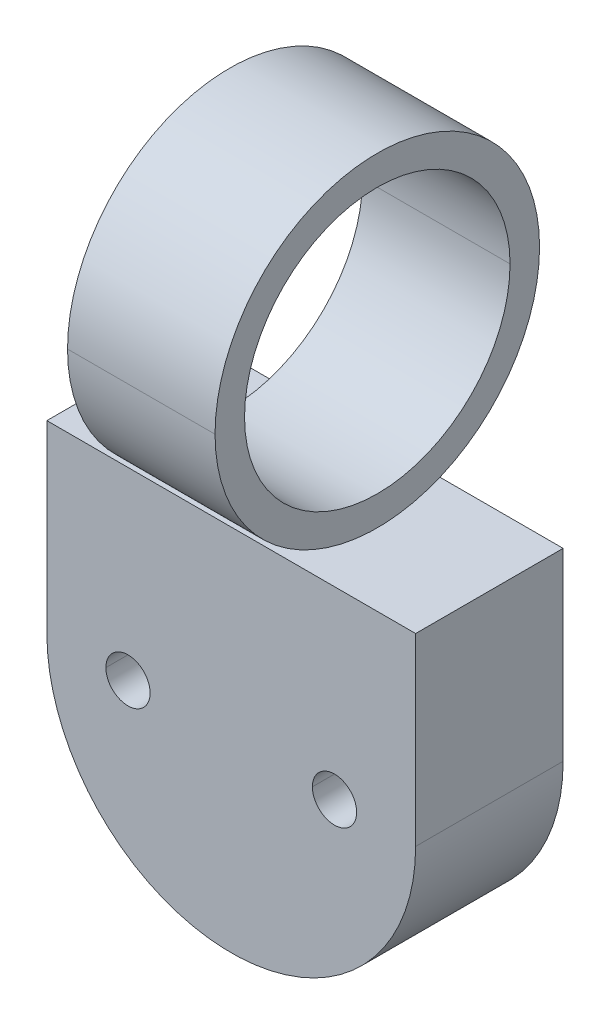
ISO-10303-21;
HEADER;
FILE_DESCRIPTION(('STEP AP214'),'2;1');
FILE_NAME('part.step','',(''),(''),'','','');
FILE_SCHEMA(('AUTOMOTIVE_DESIGN { 1 0 10303 214 1 1 1 1 }'));
ENDSEC;
DATA;
#1=APPLICATION_CONTEXT('core data for automotive mechanical design processes');
#2=APPLICATION_PROTOCOL_DEFINITION('international standard','automotive_design',2000,#1);
#3=PRODUCT_CONTEXT('',#1,'mechanical');
#4=PRODUCT('Part','Part','',(#3));
#5=PRODUCT_RELATED_PRODUCT_CATEGORY('part','',(#4));
#6=PRODUCT_DEFINITION_FORMATION('','',#4);
#7=PRODUCT_DEFINITION_CONTEXT('part definition',#1,'design');
#8=PRODUCT_DEFINITION('design','',#6,#7);
#9=PRODUCT_DEFINITION_SHAPE('','',#8);
#10=(LENGTH_UNIT() NAMED_UNIT(*) SI_UNIT(.MILLI.,.METRE.));
#11=(NAMED_UNIT(*) PLANE_ANGLE_UNIT() SI_UNIT($,.RADIAN.));
#12=(NAMED_UNIT(*) SI_UNIT($,.STERADIAN.) SOLID_ANGLE_UNIT());
#13=UNCERTAINTY_MEASURE_WITH_UNIT(LENGTH_MEASURE(1.E-05),#10,'distance_accuracy_value','');
#14=(GEOMETRIC_REPRESENTATION_CONTEXT(3) GLOBAL_UNCERTAINTY_ASSIGNED_CONTEXT((#13)) GLOBAL_UNIT_ASSIGNED_CONTEXT((#10,
#11,#12)) REPRESENTATION_CONTEXT('',''));
#15=CARTESIAN_POINT('',(0.,0.,0.));
#16=DIRECTION('',(0.,0.,1.));
#17=DIRECTION('',(1.,0.,0.));
#18=AXIS2_PLACEMENT_3D('',#15,#16,#17);
#19=CARTESIAN_POINT('',(-5.,0.,0.));
#20=DIRECTION('',(1.,0.,0.));
#21=DIRECTION('',(0.,1.,0.));
#22=AXIS2_PLACEMENT_3D('',#19,#20,#21);
#23=PLANE('',#22);
#24=CARTESIAN_POINT('',(-5.,23.5,5.09870082630493));
#25=DIRECTION('',(1.,0.,0.));
#26=DIRECTION('',(0.,0.,-1.));
#27=AXIS2_PLACEMENT_3D('',#24,#25,#26);
#28=CIRCLE('',#27,9.);
#29=CARTESIAN_POINT('',(-5.,23.5,14.0987008263049));
#30=VERTEX_POINT('',#29);
#31=CARTESIAN_POINT('',(-5.,23.5,-3.90129917369508));
#32=VERTEX_POINT('',#31);
#33=EDGE_CURVE('P0_E94',#30,#32,#28,.T.);
#34=ORIENTED_EDGE('',*,*,#33,.T.);
#35=CARTESIAN_POINT('',(-5.,23.5,5.09870082630493));
#36=DIRECTION('',(1.,0.,0.));
#37=DIRECTION('',(0.,0.,-1.));
#38=AXIS2_PLACEMENT_3D('',#35,#36,#37);
#39=CIRCLE('',#38,9.);
#40=EDGE_CURVE('P0_E10',#32,#30,#39,.T.);
#41=ORIENTED_EDGE('',*,*,#40,.T.);
#42=EDGE_LOOP('',(#34,#41));
#43=FACE_BOUND('',#42,.T.);
#44=CARTESIAN_POINT('',(-5.,23.5,5.09870082630493));
#45=DIRECTION('',(1.,0.,0.));
#46=DIRECTION('',(0.,0.,-1.));
#47=AXIS2_PLACEMENT_3D('',#44,#45,#46);
#48=CIRCLE('',#47,11.);
#49=CARTESIAN_POINT('',(-5.,23.5,16.0987008263049));
#50=VERTEX_POINT('',#49);
#51=CARTESIAN_POINT('',(-5.,23.5,-5.90129917369507));
#52=VERTEX_POINT('',#51);
#53=EDGE_CURVE('P0_E40',#50,#52,#48,.T.);
#54=ORIENTED_EDGE('',*,*,#53,.F.);
#55=CARTESIAN_POINT('',(-5.,23.5,5.09870082630493));
#56=DIRECTION('',(1.,0.,0.));
#57=DIRECTION('',(0.,0.,-1.));
#58=AXIS2_PLACEMENT_3D('',#55,#56,#57);
#59=CIRCLE('',#58,11.);
#60=EDGE_CURVE('P0_E19',#52,#50,#59,.T.);
#61=ORIENTED_EDGE('',*,*,#60,.F.);
#62=EDGE_LOOP('',(#54,#61));
#63=FACE_BOUND('',#62,.T.);
#64=ADVANCED_FACE('P0_F16',(#43,#63),#23,.F.);
#65=CARTESIAN_POINT('',(5.,0.,0.));
#66=DIRECTION('',(1.,0.,0.));
#67=DIRECTION('',(0.,1.,0.));
#68=AXIS2_PLACEMENT_3D('',#65,#66,#67);
#69=PLANE('',#68);
#70=CARTESIAN_POINT('',(5.,23.5,5.09870082630493));
#71=DIRECTION('',(1.,0.,0.));
#72=DIRECTION('',(0.,0.,-1.));
#73=AXIS2_PLACEMENT_3D('',#70,#71,#72);
#74=CIRCLE('',#73,9.);
#75=CARTESIAN_POINT('',(5.,23.5,14.0987008263049));
#76=VERTEX_POINT('',#75);
#77=CARTESIAN_POINT('',(5.,23.5,-3.90129917369508));
#78=VERTEX_POINT('',#77);
#79=EDGE_CURVE('P0_E99',#76,#78,#74,.T.);
#80=ORIENTED_EDGE('',*,*,#79,.F.);
#81=CARTESIAN_POINT('',(5.,23.5,5.09870082630493));
#82=DIRECTION('',(1.,0.,0.));
#83=DIRECTION('',(0.,0.,-1.));
#84=AXIS2_PLACEMENT_3D('',#81,#82,#83);
#85=CIRCLE('',#84,9.);
#86=EDGE_CURVE('P0_E26',#78,#76,#85,.T.);
#87=ORIENTED_EDGE('',*,*,#86,.F.);
#88=EDGE_LOOP('',(#80,#87));
#89=FACE_BOUND('',#88,.T.);
#90=CARTESIAN_POINT('',(5.,23.5,5.09870082630493));
#91=DIRECTION('',(1.,0.,0.));
#92=DIRECTION('',(0.,0.,-1.));
#93=AXIS2_PLACEMENT_3D('',#90,#91,#92);
#94=CIRCLE('',#93,11.);
#95=CARTESIAN_POINT('',(5.,23.5,16.0987008263049));
#96=VERTEX_POINT('',#95);
#97=CARTESIAN_POINT('',(5.,23.5,-5.90129917369507));
#98=VERTEX_POINT('',#97);
#99=EDGE_CURVE('P0_E55',#96,#98,#94,.T.);
#100=ORIENTED_EDGE('',*,*,#99,.T.);
#101=CARTESIAN_POINT('',(5.,23.5,5.09870082630493));
#102=DIRECTION('',(1.,0.,0.));
#103=DIRECTION('',(0.,0.,-1.));
#104=AXIS2_PLACEMENT_3D('',#101,#102,#103);
#105=CIRCLE('',#104,11.);
#106=EDGE_CURVE('P0_E111',#98,#96,#105,.T.);
#107=ORIENTED_EDGE('',*,*,#106,.T.);
#108=EDGE_LOOP('',(#100,#107));
#109=FACE_BOUND('',#108,.T.);
#110=ADVANCED_FACE('P0_F132',(#89,#109),#69,.T.);
#111=CARTESIAN_POINT('',(5.,23.5,5.09870082630493));
#112=DIRECTION('',(-1.,0.,0.));
#113=DIRECTION('',(0.,0.,1.));
#114=AXIS2_PLACEMENT_3D('',#111,#112,#113);
#115=CYLINDRICAL_SURFACE('',#114,9.);
#116=DIRECTION('',(-1.,0.,0.));
#117=VECTOR('',#116,1.);
#118=CARTESIAN_POINT('',(5.,23.5,-3.90129917369508));
#119=LINE('',#118,#117);
#120=EDGE_CURVE('P0_E89',#78,#32,#119,.T.);
#121=ORIENTED_EDGE('',*,*,#120,.F.);
#122=ORIENTED_EDGE('',*,*,#86,.T.);
#123=DIRECTION('',(-1.,0.,0.));
#124=VECTOR('',#123,1.);
#125=CARTESIAN_POINT('',(5.,23.5,14.0987008263049));
#126=LINE('',#125,#124);
#127=EDGE_CURVE('P0_E91',#76,#30,#126,.T.);
#128=ORIENTED_EDGE('',*,*,#127,.T.);
#129=ORIENTED_EDGE('',*,*,#40,.F.);
#130=EDGE_LOOP('',(#121,#122,#128,#129));
#131=FACE_BOUND('',#130,.T.);
#132=ADVANCED_FACE('P0_F87',(#131),#115,.F.);
#133=CARTESIAN_POINT('',(5.,23.5,5.09870082630493));
#134=DIRECTION('',(-1.,0.,0.));
#135=DIRECTION('',(0.,0.,1.));
#136=AXIS2_PLACEMENT_3D('',#133,#134,#135);
#137=CYLINDRICAL_SURFACE('',#136,11.);
#138=DIRECTION('',(-1.,0.,0.));
#139=VECTOR('',#138,1.);
#140=CARTESIAN_POINT('',(5.,23.5,-5.90129917369507));
#141=LINE('',#140,#139);
#142=EDGE_CURVE('P0_E108',#98,#52,#141,.T.);
#143=ORIENTED_EDGE('',*,*,#142,.F.);
#144=ORIENTED_EDGE('',*,*,#99,.F.);
#145=DIRECTION('',(-1.,0.,0.));
#146=VECTOR('',#145,1.);
#147=CARTESIAN_POINT('',(5.,23.5,16.0987008263049));
#148=LINE('',#147,#146);
#149=EDGE_CURVE('P0_E119',#96,#50,#148,.T.);
#150=ORIENTED_EDGE('',*,*,#149,.T.);
#151=ORIENTED_EDGE('',*,*,#53,.T.);
#152=EDGE_LOOP('',(#143,#144,#150,#151));
#153=FACE_BOUND('',#152,.T.);
#154=ADVANCED_FACE('P0_F126',(#153),#137,.T.);
#155=CARTESIAN_POINT('',(5.,23.5,5.09870082630493));
#156=DIRECTION('',(-1.,0.,0.));
#157=DIRECTION('',(0.,0.,1.));
#158=AXIS2_PLACEMENT_3D('',#155,#156,#157);
#159=CYLINDRICAL_SURFACE('',#158,11.);
#160=ORIENTED_EDGE('',*,*,#106,.F.);
#161=ORIENTED_EDGE('',*,*,#142,.T.);
#162=ORIENTED_EDGE('',*,*,#60,.T.);
#163=ORIENTED_EDGE('',*,*,#149,.F.);
#164=EDGE_LOOP('',(#160,#161,#162,#163));
#165=FACE_BOUND('',#164,.T.);
#166=ADVANCED_FACE('P0_F131',(#165),#159,.T.);
#167=CARTESIAN_POINT('',(5.,23.5,5.09870082630493));
#168=DIRECTION('',(-1.,0.,0.));
#169=DIRECTION('',(0.,0.,1.));
#170=AXIS2_PLACEMENT_3D('',#167,#168,#169);
#171=CYLINDRICAL_SURFACE('',#170,9.);
#172=ORIENTED_EDGE('',*,*,#79,.T.);
#173=ORIENTED_EDGE('',*,*,#120,.T.);
#174=ORIENTED_EDGE('',*,*,#33,.F.);
#175=ORIENTED_EDGE('',*,*,#127,.F.);
#176=EDGE_LOOP('',(#172,#173,#174,#175));
#177=FACE_BOUND('',#176,.T.);
#178=ADVANCED_FACE('P0_F98',(#177),#171,.F.);
#179=CLOSED_SHELL('',(#64,#110,#132,#154,#166,#178));
#180=MANIFOLD_SOLID_BREP('P0_B1',#179);
#181=CARTESIAN_POINT('',(7.,0.,10.));
#182=DIRECTION('',(0.,0.,-1.));
#183=DIRECTION('',(-1.,0.,0.));
#184=AXIS2_PLACEMENT_3D('',#181,#182,#183);
#185=CYLINDRICAL_SURFACE('',#184,1.5);
#186=DIRECTION('',(0.,0.,-1.));
#187=VECTOR('',#186,1.);
#188=CARTESIAN_POINT('',(8.5,0.,10.));
#189=LINE('',#188,#187);
#190=CARTESIAN_POINT('',(8.5,0.,10.));
#191=VERTEX_POINT('',#190);
#192=CARTESIAN_POINT('',(8.5,0.,0.));
#193=VERTEX_POINT('',#192);
#194=EDGE_CURVE('P1_E133',#191,#193,#189,.T.);
#195=ORIENTED_EDGE('',*,*,#194,.F.);
#196=CARTESIAN_POINT('',(7.,0.,10.));
#197=DIRECTION('',(0.,0.,1.));
#198=DIRECTION('',(-1.,0.,0.));
#199=AXIS2_PLACEMENT_3D('',#196,#197,#198);
#200=CIRCLE('',#199,1.5);
#201=CARTESIAN_POINT('',(5.5,0.,10.));
#202=VERTEX_POINT('',#201);
#203=EDGE_CURVE('P1_E126',#191,#202,#200,.T.);
#204=ORIENTED_EDGE('',*,*,#203,.T.);
#205=DIRECTION('',(0.,0.,-1.));
#206=VECTOR('',#205,1.);
#207=CARTESIAN_POINT('',(5.5,0.,10.));
#208=LINE('',#207,#206);
#209=CARTESIAN_POINT('',(5.5,0.,0.));
#210=VERTEX_POINT('',#209);
#211=EDGE_CURVE('P1_E130',#202,#210,#208,.T.);
#212=ORIENTED_EDGE('',*,*,#211,.T.);
#213=CARTESIAN_POINT('',(7.,0.,0.));
#214=DIRECTION('',(0.,0.,1.));
#215=DIRECTION('',(-1.,0.,0.));
#216=AXIS2_PLACEMENT_3D('',#213,#214,#215);
#217=CIRCLE('',#216,1.5);
#218=EDGE_CURVE('P1_E116',#193,#210,#217,.T.);
#219=ORIENTED_EDGE('',*,*,#218,.F.);
#220=EDGE_LOOP('',(#195,#204,#212,#219));
#221=FACE_BOUND('',#220,.T.);
#222=ADVANCED_FACE('P1_F16',(#221),#185,.F.);
#223=CARTESIAN_POINT('',(-7.,0.,10.));
#224=DIRECTION('',(0.,0.,-1.));
#225=DIRECTION('',(-1.,0.,0.));
#226=AXIS2_PLACEMENT_3D('',#223,#224,#225);
#227=CYLINDRICAL_SURFACE('',#226,1.5);
#228=DIRECTION('',(0.,0.,-1.));
#229=VECTOR('',#228,1.);
#230=CARTESIAN_POINT('',(-5.5,0.,10.));
#231=LINE('',#230,#229);
#232=CARTESIAN_POINT('',(-5.5,0.,10.));
#233=VERTEX_POINT('',#232);
#234=CARTESIAN_POINT('',(-5.5,0.,0.));
#235=VERTEX_POINT('',#234);
#236=EDGE_CURVE('P1_E175',#233,#235,#231,.T.);
#237=ORIENTED_EDGE('',*,*,#236,.F.);
#238=CARTESIAN_POINT('',(-7.,0.,10.));
#239=DIRECTION('',(0.,0.,1.));
#240=DIRECTION('',(1.,0.,0.));
#241=AXIS2_PLACEMENT_3D('',#238,#239,#240);
#242=CIRCLE('',#241,1.5);
#243=CARTESIAN_POINT('',(-8.5,0.,10.));
#244=VERTEX_POINT('',#243);
#245=EDGE_CURVE('P1_E93',#233,#244,#242,.T.);
#246=ORIENTED_EDGE('',*,*,#245,.T.);
#247=DIRECTION('',(0.,0.,-1.));
#248=VECTOR('',#247,1.);
#249=CARTESIAN_POINT('',(-8.5,0.,10.));
#250=LINE('',#249,#248);
#251=CARTESIAN_POINT('',(-8.5,0.,0.));
#252=VERTEX_POINT('',#251);
#253=EDGE_CURVE('P1_E171',#244,#252,#250,.T.);
#254=ORIENTED_EDGE('',*,*,#253,.T.);
#255=CARTESIAN_POINT('',(-7.,0.,0.));
#256=DIRECTION('',(0.,0.,1.));
#257=DIRECTION('',(1.,0.,0.));
#258=AXIS2_PLACEMENT_3D('',#255,#256,#257);
#259=CIRCLE('',#258,1.5);
#260=EDGE_CURVE('P1_E180',#235,#252,#259,.T.);
#261=ORIENTED_EDGE('',*,*,#260,.F.);
#262=EDGE_LOOP('',(#237,#246,#254,#261));
#263=FACE_BOUND('',#262,.T.);
#264=ADVANCED_FACE('P1_F326',(#263),#227,.F.);
#265=CARTESIAN_POINT('',(12.5,12.5,10.));
#266=DIRECTION('',(0.,-1.,0.));
#267=DIRECTION('',(0.,0.,-1.));
#268=AXIS2_PLACEMENT_3D('',#265,#266,#267);
#269=PLANE('',#268);
#270=DIRECTION('',(-1.,0.,0.));
#271=VECTOR('',#270,1.);
#272=CARTESIAN_POINT('',(12.5,12.5,0.));
#273=LINE('',#272,#271);
#274=CARTESIAN_POINT('',(12.5,12.5,0.));
#275=VERTEX_POINT('',#274);
#276=CARTESIAN_POINT('',(-12.5,12.5,0.));
#277=VERTEX_POINT('',#276);
#278=EDGE_CURVE('P1_E156',#275,#277,#273,.T.);
#279=ORIENTED_EDGE('',*,*,#278,.T.);
#280=DIRECTION('',(0.,0.,-1.));
#281=VECTOR('',#280,1.);
#282=CARTESIAN_POINT('',(-12.5,12.5,10.));
#283=LINE('',#282,#281);
#284=CARTESIAN_POINT('',(-12.5,12.5,10.));
#285=VERTEX_POINT('',#284);
#286=EDGE_CURVE('P1_E164',#285,#277,#283,.T.);
#287=ORIENTED_EDGE('',*,*,#286,.F.);
#288=DIRECTION('',(-1.,0.,0.));
#289=VECTOR('',#288,1.);
#290=CARTESIAN_POINT('',(12.5,12.5,10.));
#291=LINE('',#290,#289);
#292=CARTESIAN_POINT('',(12.5,12.5,10.));
#293=VERTEX_POINT('',#292);
#294=EDGE_CURVE('P1_E199',#293,#285,#291,.T.);
#295=ORIENTED_EDGE('',*,*,#294,.F.);
#296=DIRECTION('',(0.,0.,-1.));
#297=VECTOR('',#296,1.);
#298=CARTESIAN_POINT('',(12.5,12.5,10.));
#299=LINE('',#298,#297);
#300=EDGE_CURVE('P1_E10',#293,#275,#299,.T.);
#301=ORIENTED_EDGE('',*,*,#300,.T.);
#302=EDGE_LOOP('',(#279,#287,#295,#301));
#303=FACE_BOUND('',#302,.T.);
#304=ADVANCED_FACE('P1_F319',(#303),#269,.F.);
#305=CARTESIAN_POINT('',(12.5,0.,10.));
#306=DIRECTION('',(-1.,0.,0.));
#307=DIRECTION('',(0.,0.,1.));
#308=AXIS2_PLACEMENT_3D('',#305,#306,#307);
#309=PLANE('',#308);
#310=DIRECTION('',(0.,1.,0.));
#311=VECTOR('',#310,1.);
#312=CARTESIAN_POINT('',(12.5,0.,0.));
#313=LINE('',#312,#311);
#314=CARTESIAN_POINT('',(12.5,0.,0.));
#315=VERTEX_POINT('',#314);
#316=EDGE_CURVE('P1_E160',#315,#275,#313,.T.);
#317=ORIENTED_EDGE('',*,*,#316,.T.);
#318=ORIENTED_EDGE('',*,*,#300,.F.);
#319=DIRECTION('',(0.,1.,0.));
#320=VECTOR('',#319,1.);
#321=CARTESIAN_POINT('',(12.5,0.,10.));
#322=LINE('',#321,#320);
#323=CARTESIAN_POINT('',(12.5,0.,10.));
#324=VERTEX_POINT('',#323);
#325=EDGE_CURVE('P1_E20',#324,#293,#322,.T.);
#326=ORIENTED_EDGE('',*,*,#325,.F.);
#327=DIRECTION('',(0.,0.,-1.));
#328=VECTOR('',#327,1.);
#329=CARTESIAN_POINT('',(12.5,0.,10.));
#330=LINE('',#329,#328);
#331=EDGE_CURVE('P1_E27',#324,#315,#330,.T.);
#332=ORIENTED_EDGE('',*,*,#331,.T.);
#333=EDGE_LOOP('',(#317,#318,#326,#332));
#334=FACE_BOUND('',#333,.T.);
#335=ADVANCED_FACE('P1_F300',(#334),#309,.F.);
#336=CARTESIAN_POINT('',(0.,0.,10.));
#337=DIRECTION('',(0.,0.,-1.));
#338=DIRECTION('',(-1.,0.,0.));
#339=AXIS2_PLACEMENT_3D('',#336,#337,#338);
#340=CYLINDRICAL_SURFACE('',#339,12.5);
#341=CARTESIAN_POINT('',(0.,0.,0.));
#342=DIRECTION('',(0.,0.,1.));
#343=DIRECTION('',(1.,0.,0.));
#344=AXIS2_PLACEMENT_3D('',#341,#342,#343);
#345=CIRCLE('',#344,12.5);
#346=CARTESIAN_POINT('',(-12.5,0.,0.));
#347=VERTEX_POINT('',#346);
#348=EDGE_CURVE('P1_E203',#347,#315,#345,.T.);
#349=ORIENTED_EDGE('',*,*,#348,.T.);
#350=ORIENTED_EDGE('',*,*,#331,.F.);
#351=CARTESIAN_POINT('',(0.,0.,10.));
#352=DIRECTION('',(0.,0.,1.));
#353=DIRECTION('',(1.,0.,0.));
#354=AXIS2_PLACEMENT_3D('',#351,#352,#353);
#355=CIRCLE('',#354,12.5);
#356=CARTESIAN_POINT('',(-12.5,0.,10.));
#357=VERTEX_POINT('',#356);
#358=EDGE_CURVE('P1_E170',#357,#324,#355,.T.);
#359=ORIENTED_EDGE('',*,*,#358,.F.);
#360=DIRECTION('',(0.,0.,-1.));
#361=VECTOR('',#360,1.);
#362=CARTESIAN_POINT('',(-12.5,0.,10.));
#363=LINE('',#362,#361);
#364=EDGE_CURVE('P1_E75',#357,#347,#363,.T.);
#365=ORIENTED_EDGE('',*,*,#364,.T.);
#366=EDGE_LOOP('',(#349,#350,#359,#365));
#367=FACE_BOUND('',#366,.T.);
#368=ADVANCED_FACE('P1_F290',(#367),#340,.T.);
#369=CARTESIAN_POINT('',(-12.5,0.,10.));
#370=DIRECTION('',(1.,0.,0.));
#371=DIRECTION('',(0.,1.,0.));
#372=AXIS2_PLACEMENT_3D('',#369,#370,#371);
#373=PLANE('',#372);
#374=DIRECTION('',(0.,-1.,0.));
#375=VECTOR('',#374,1.);
#376=CARTESIAN_POINT('',(-12.5,0.,0.));
#377=LINE('',#376,#375);
#378=EDGE_CURVE('P1_E136',#277,#347,#377,.T.);
#379=ORIENTED_EDGE('',*,*,#378,.T.);
#380=ORIENTED_EDGE('',*,*,#364,.F.);
#381=DIRECTION('',(0.,-1.,0.));
#382=VECTOR('',#381,1.);
#383=CARTESIAN_POINT('',(-12.5,0.,10.));
#384=LINE('',#383,#382);
#385=EDGE_CURVE('P1_E166',#285,#357,#384,.T.);
#386=ORIENTED_EDGE('',*,*,#385,.F.);
#387=ORIENTED_EDGE('',*,*,#286,.T.);
#388=EDGE_LOOP('',(#379,#380,#386,#387));
#389=FACE_BOUND('',#388,.T.);
#390=ADVANCED_FACE('P1_F284',(#389),#373,.F.);
#391=CARTESIAN_POINT('',(0.,0.,0.));
#392=DIRECTION('',(0.,0.,1.));
#393=DIRECTION('',(1.,0.,0.));
#394=AXIS2_PLACEMENT_3D('',#391,#392,#393);
#395=PLANE('',#394);
#396=CARTESIAN_POINT('',(7.,0.,0.));
#397=DIRECTION('',(0.,0.,1.));
#398=DIRECTION('',(-1.,0.,0.));
#399=AXIS2_PLACEMENT_3D('',#396,#397,#398);
#400=CIRCLE('',#399,1.5);
#401=EDGE_CURVE('P1_E141',#210,#193,#400,.T.);
#402=ORIENTED_EDGE('',*,*,#401,.T.);
#403=ORIENTED_EDGE('',*,*,#218,.T.);
#404=EDGE_LOOP('',(#402,#403));
#405=FACE_BOUND('',#404,.T.);
#406=CARTESIAN_POINT('',(-7.,0.,0.));
#407=DIRECTION('',(0.,0.,1.));
#408=DIRECTION('',(1.,0.,0.));
#409=AXIS2_PLACEMENT_3D('',#406,#407,#408);
#410=CIRCLE('',#409,1.5);
#411=EDGE_CURVE('P1_E153',#252,#235,#410,.T.);
#412=ORIENTED_EDGE('',*,*,#411,.T.);
#413=ORIENTED_EDGE('',*,*,#260,.T.);
#414=EDGE_LOOP('',(#412,#413));
#415=FACE_BOUND('',#414,.T.);
#416=ORIENTED_EDGE('',*,*,#378,.F.);
#417=ORIENTED_EDGE('',*,*,#278,.F.);
#418=ORIENTED_EDGE('',*,*,#316,.F.);
#419=ORIENTED_EDGE('',*,*,#348,.F.);
#420=EDGE_LOOP('',(#416,#417,#418,#419));
#421=FACE_BOUND('',#420,.T.);
#422=ADVANCED_FACE('P1_F289',(#405,#415,#421),#395,.F.);
#423=CARTESIAN_POINT('',(0.,0.,10.));
#424=DIRECTION('',(0.,0.,1.));
#425=DIRECTION('',(1.,0.,0.));
#426=AXIS2_PLACEMENT_3D('',#423,#424,#425);
#427=PLANE('',#426);
#428=CARTESIAN_POINT('',(7.,0.,10.));
#429=DIRECTION('',(0.,0.,1.));
#430=DIRECTION('',(-1.,0.,0.));
#431=AXIS2_PLACEMENT_3D('',#428,#429,#430);
#432=CIRCLE('',#431,1.5);
#433=EDGE_CURVE('P1_E140',#202,#191,#432,.T.);
#434=ORIENTED_EDGE('',*,*,#433,.F.);
#435=ORIENTED_EDGE('',*,*,#203,.F.);
#436=EDGE_LOOP('',(#434,#435));
#437=FACE_BOUND('',#436,.T.);
#438=CARTESIAN_POINT('',(-7.,0.,10.));
#439=DIRECTION('',(0.,0.,1.));
#440=DIRECTION('',(1.,0.,0.));
#441=AXIS2_PLACEMENT_3D('',#438,#439,#440);
#442=CIRCLE('',#441,1.5);
#443=EDGE_CURVE('P1_E143',#244,#233,#442,.T.);
#444=ORIENTED_EDGE('',*,*,#443,.F.);
#445=ORIENTED_EDGE('',*,*,#245,.F.);
#446=EDGE_LOOP('',(#444,#445));
#447=FACE_BOUND('',#446,.T.);
#448=ORIENTED_EDGE('',*,*,#385,.T.);
#449=ORIENTED_EDGE('',*,*,#358,.T.);
#450=ORIENTED_EDGE('',*,*,#325,.T.);
#451=ORIENTED_EDGE('',*,*,#294,.T.);
#452=EDGE_LOOP('',(#448,#449,#450,#451));
#453=FACE_BOUND('',#452,.T.);
#454=ADVANCED_FACE('P1_F144',(#437,#447,#453),#427,.T.);
#455=CARTESIAN_POINT('',(-7.,0.,10.));
#456=DIRECTION('',(0.,0.,-1.));
#457=DIRECTION('',(-1.,0.,0.));
#458=AXIS2_PLACEMENT_3D('',#455,#456,#457);
#459=CYLINDRICAL_SURFACE('',#458,1.5);
#460=ORIENTED_EDGE('',*,*,#443,.T.);
#461=ORIENTED_EDGE('',*,*,#236,.T.);
#462=ORIENTED_EDGE('',*,*,#411,.F.);
#463=ORIENTED_EDGE('',*,*,#253,.F.);
#464=EDGE_LOOP('',(#460,#461,#462,#463));
#465=FACE_BOUND('',#464,.T.);
#466=ADVANCED_FACE('P1_F18',(#465),#459,.F.);
#467=CARTESIAN_POINT('',(7.,0.,10.));
#468=DIRECTION('',(0.,0.,-1.));
#469=DIRECTION('',(-1.,0.,0.));
#470=AXIS2_PLACEMENT_3D('',#467,#468,#469);
#471=CYLINDRICAL_SURFACE('',#470,1.5);
#472=ORIENTED_EDGE('',*,*,#433,.T.);
#473=ORIENTED_EDGE('',*,*,#194,.T.);
#474=ORIENTED_EDGE('',*,*,#401,.F.);
#475=ORIENTED_EDGE('',*,*,#211,.F.);
#476=EDGE_LOOP('',(#472,#473,#474,#475));
#477=FACE_BOUND('',#476,.T.);
#478=ADVANCED_FACE('P1_F139',(#477),#471,.F.);
#479=CLOSED_SHELL('',(#222,#264,#304,#335,#368,#390,#422,#454,#466,#478));
#480=MANIFOLD_SOLID_BREP('P1_B1',#479);
#481=ADVANCED_BREP_SHAPE_REPRESENTATION('',(#18,#180,#480),#14);
#482=SHAPE_DEFINITION_REPRESENTATION(#9,#481);
ENDSEC;
END-ISO-10303-21;
